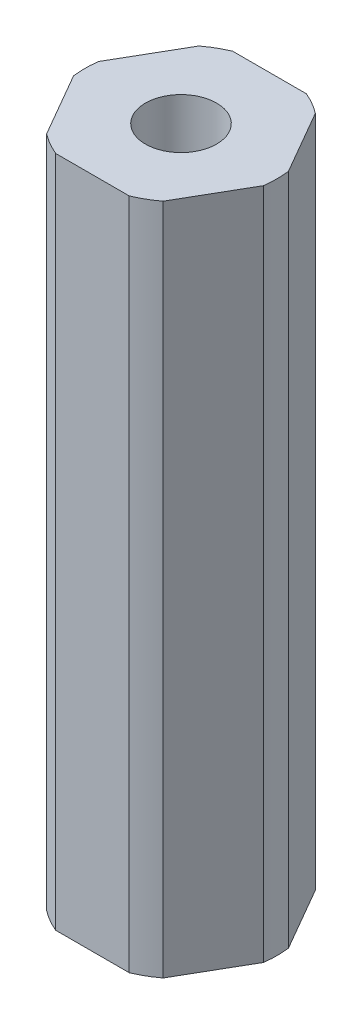
ISO-10303-21;
HEADER;
FILE_DESCRIPTION(('STEP AP214'),'2;1');
FILE_NAME('part.step','',(''),(''),'','','');
FILE_SCHEMA(('AUTOMOTIVE_DESIGN { 1 0 10303 214 1 1 1 1 }'));
ENDSEC;
DATA;
#1=APPLICATION_CONTEXT('core data for automotive mechanical design processes');
#2=APPLICATION_PROTOCOL_DEFINITION('international standard','automotive_design',2000,#1);
#3=PRODUCT_CONTEXT('',#1,'mechanical');
#4=PRODUCT('Part','Part','',(#3));
#5=PRODUCT_RELATED_PRODUCT_CATEGORY('part','',(#4));
#6=PRODUCT_DEFINITION_FORMATION('','',#4);
#7=PRODUCT_DEFINITION_CONTEXT('part definition',#1,'design');
#8=PRODUCT_DEFINITION('design','',#6,#7);
#9=PRODUCT_DEFINITION_SHAPE('','',#8);
#10=(LENGTH_UNIT() NAMED_UNIT(*) SI_UNIT(.MILLI.,.METRE.));
#11=(NAMED_UNIT(*) PLANE_ANGLE_UNIT() SI_UNIT($,.RADIAN.));
#12=(NAMED_UNIT(*) SI_UNIT($,.STERADIAN.) SOLID_ANGLE_UNIT());
#13=UNCERTAINTY_MEASURE_WITH_UNIT(LENGTH_MEASURE(1.E-05),#10,'distance_accuracy_value','');
#14=(GEOMETRIC_REPRESENTATION_CONTEXT(3) GLOBAL_UNCERTAINTY_ASSIGNED_CONTEXT((#13)) GLOBAL_UNIT_ASSIGNED_CONTEXT((#10,
#11,#12)) REPRESENTATION_CONTEXT('',''));
#15=CARTESIAN_POINT('',(0.,0.,0.));
#16=DIRECTION('',(0.,0.,1.));
#17=DIRECTION('',(1.,0.,0.));
#18=AXIS2_PLACEMENT_3D('',#15,#16,#17);
#19=CARTESIAN_POINT('',(0.,24.13,6.35));
#20=DIRECTION('',(0.,0.,-1.));
#21=DIRECTION('',(-1.,0.,0.));
#22=AXIS2_PLACEMENT_3D('',#19,#20,#21);
#23=PLANE('',#22);
#24=DIRECTION('',(1.,0.,0.));
#25=VECTOR('',#24,1.);
#26=CARTESIAN_POINT('',(0.,-24.13,6.35));
#27=LINE('',#26,#25);
#28=CARTESIAN_POINT('',(-2.63701547367474,-24.13,6.35));
#29=VERTEX_POINT('',#28);
#30=CARTESIAN_POINT('',(2.63701547367474,-24.13,6.35));
#31=VERTEX_POINT('',#30);
#32=EDGE_CURVE('E163',#29,#31,#27,.T.);
#33=ORIENTED_EDGE('',*,*,#32,.T.);
#34=DIRECTION('',(0.,-1.,0.));
#35=VECTOR('',#34,1.);
#36=CARTESIAN_POINT('',(2.63701547367474,24.13,6.35));
#37=LINE('',#36,#35);
#38=CARTESIAN_POINT('',(2.63701547367474,24.13,6.35));
#39=VERTEX_POINT('',#38);
#40=EDGE_CURVE('E11',#39,#31,#37,.T.);
#41=ORIENTED_EDGE('',*,*,#40,.F.);
#42=DIRECTION('',(1.,0.,0.));
#43=VECTOR('',#42,1.);
#44=CARTESIAN_POINT('',(0.,24.13,6.35));
#45=LINE('',#44,#43);
#46=CARTESIAN_POINT('',(-2.63701547367474,24.13,6.35));
#47=VERTEX_POINT('',#46);
#48=EDGE_CURVE('E222',#47,#39,#45,.T.);
#49=ORIENTED_EDGE('',*,*,#48,.F.);
#50=DIRECTION('',(0.,-1.,0.));
#51=VECTOR('',#50,1.);
#52=CARTESIAN_POINT('',(-2.63701547367474,24.13,6.35));
#53=LINE('',#52,#51);
#54=EDGE_CURVE('E156',#47,#29,#53,.T.);
#55=ORIENTED_EDGE('',*,*,#54,.T.);
#56=EDGE_LOOP('',(#33,#41,#49,#55));
#57=FACE_BOUND('',#56,.T.);
#58=ADVANCED_FACE('F38',(#57),#23,.F.);
#59=CARTESIAN_POINT('',(0.,24.13,0.));
#60=DIRECTION('',(0.,-1.,0.));
#61=DIRECTION('',(0.,0.,-1.));
#62=AXIS2_PLACEMENT_3D('',#59,#60,#61);
#63=CYLINDRICAL_SURFACE('',#62,6.87578);
#64=CARTESIAN_POINT('',(0.,-24.13,0.));
#65=DIRECTION('',(0.,1.,0.));
#66=DIRECTION('',(0.,0.,1.));
#67=AXIS2_PLACEMENT_3D('',#64,#65,#66);
#68=CIRCLE('',#67,6.87578);
#69=CARTESIAN_POINT('',(4.18075357719382,-24.13,5.45872239037497));
#70=VERTEX_POINT('',#69);
#71=EDGE_CURVE('E166',#31,#70,#68,.T.);
#72=ORIENTED_EDGE('',*,*,#71,.T.);
#73=DIRECTION('',(0.,-1.,0.));
#74=VECTOR('',#73,1.);
#75=CARTESIAN_POINT('',(4.18075357719382,24.13,5.45872239037497));
#76=LINE('',#75,#74);
#77=CARTESIAN_POINT('',(4.18075357719382,24.13,5.45872239037497));
#78=VERTEX_POINT('',#77);
#79=EDGE_CURVE('E47',#78,#70,#76,.T.);
#80=ORIENTED_EDGE('',*,*,#79,.F.);
#81=CARTESIAN_POINT('',(0.,24.13,0.));
#82=DIRECTION('',(0.,1.,0.));
#83=DIRECTION('',(0.,0.,1.));
#84=AXIS2_PLACEMENT_3D('',#81,#82,#83);
#85=CIRCLE('',#84,6.87578);
#86=EDGE_CURVE('E110',#39,#78,#85,.T.);
#87=ORIENTED_EDGE('',*,*,#86,.F.);
#88=ORIENTED_EDGE('',*,*,#40,.T.);
#89=EDGE_LOOP('',(#72,#80,#87,#88));
#90=FACE_BOUND('',#89,.T.);
#91=ADVANCED_FACE('F257',(#90),#63,.T.);
#92=CARTESIAN_POINT('',(5.49926131403119,24.13,3.175));
#93=DIRECTION('',(-0.866025403784439,0.,-0.5));
#94=DIRECTION('',(-0.5,0.,0.866025403784439));
#95=AXIS2_PLACEMENT_3D('',#92,#93,#94);
#96=PLANE('',#95);
#97=DIRECTION('',(0.5,0.,-0.866025403784439));
#98=VECTOR('',#97,1.);
#99=CARTESIAN_POINT('',(5.49926131403119,-24.13,3.175));
#100=LINE('',#99,#98);
#101=CARTESIAN_POINT('',(6.81776905086855,-24.13,0.891277609625022));
#102=VERTEX_POINT('',#101);
#103=EDGE_CURVE('E168',#70,#102,#100,.T.);
#104=ORIENTED_EDGE('',*,*,#103,.T.);
#105=DIRECTION('',(0.,-1.,0.));
#106=VECTOR('',#105,1.);
#107=CARTESIAN_POINT('',(6.81776905086855,24.13,0.891277609625022));
#108=LINE('',#107,#106);
#109=CARTESIAN_POINT('',(6.81776905086855,24.13,0.891277609625022));
#110=VERTEX_POINT('',#109);
#111=EDGE_CURVE('E198',#110,#102,#108,.T.);
#112=ORIENTED_EDGE('',*,*,#111,.F.);
#113=DIRECTION('',(0.5,0.,-0.866025403784439));
#114=VECTOR('',#113,1.);
#115=CARTESIAN_POINT('',(5.49926131403119,24.13,3.175));
#116=LINE('',#115,#114);
#117=EDGE_CURVE('E206',#78,#110,#116,.T.);
#118=ORIENTED_EDGE('',*,*,#117,.F.);
#119=ORIENTED_EDGE('',*,*,#79,.T.);
#120=EDGE_LOOP('',(#104,#112,#118,#119));
#121=FACE_BOUND('',#120,.T.);
#122=ADVANCED_FACE('F204',(#121),#96,.F.);
#123=CARTESIAN_POINT('',(6.81776905086856,-24.13,-0.891277609625022));
#124=VERTEX_POINT('',#123);
#125=EDGE_CURVE('E169',#102,#124,#68,.T.);
#126=ORIENTED_EDGE('',*,*,#125,.T.);
#127=DIRECTION('',(0.,-1.,0.));
#128=VECTOR('',#127,1.);
#129=CARTESIAN_POINT('',(6.81776905086856,24.13,-0.891277609625022));
#130=LINE('',#129,#128);
#131=CARTESIAN_POINT('',(6.81776905086856,24.13,-0.891277609625022));
#132=VERTEX_POINT('',#131);
#133=EDGE_CURVE('E195',#132,#124,#130,.T.);
#134=ORIENTED_EDGE('',*,*,#133,.F.);
#135=EDGE_CURVE('E228',#110,#132,#85,.T.);
#136=ORIENTED_EDGE('',*,*,#135,.F.);
#137=ORIENTED_EDGE('',*,*,#111,.T.);
#138=EDGE_LOOP('',(#126,#134,#136,#137));
#139=FACE_BOUND('',#138,.T.);
#140=ADVANCED_FACE('F239',(#139),#63,.T.);
#141=CARTESIAN_POINT('',(5.49926131403118,24.13,-3.175));
#142=DIRECTION('',(-0.866025403784438,0.,0.5));
#143=DIRECTION('',(0.5,0.,0.866025403784439));
#144=AXIS2_PLACEMENT_3D('',#141,#142,#143);
#145=PLANE('',#144);
#146=DIRECTION('',(-0.5,0.,-0.866025403784439));
#147=VECTOR('',#146,1.);
#148=CARTESIAN_POINT('',(5.49926131403118,-24.13,-3.175));
#149=LINE('',#148,#147);
#150=CARTESIAN_POINT('',(4.18075357719381,-24.13,-5.45872239037498));
#151=VERTEX_POINT('',#150);
#152=EDGE_CURVE('E171',#124,#151,#149,.T.);
#153=ORIENTED_EDGE('',*,*,#152,.T.);
#154=DIRECTION('',(0.,-1.,0.));
#155=VECTOR('',#154,1.);
#156=CARTESIAN_POINT('',(4.18075357719381,24.13,-5.45872239037498));
#157=LINE('',#156,#155);
#158=CARTESIAN_POINT('',(4.18075357719381,24.13,-5.45872239037498));
#159=VERTEX_POINT('',#158);
#160=EDGE_CURVE('E192',#159,#151,#157,.T.);
#161=ORIENTED_EDGE('',*,*,#160,.F.);
#162=DIRECTION('',(-0.5,0.,-0.866025403784439));
#163=VECTOR('',#162,1.);
#164=CARTESIAN_POINT('',(5.49926131403118,24.13,-3.175));
#165=LINE('',#164,#163);
#166=EDGE_CURVE('E230',#132,#159,#165,.T.);
#167=ORIENTED_EDGE('',*,*,#166,.F.);
#168=ORIENTED_EDGE('',*,*,#133,.T.);
#169=EDGE_LOOP('',(#153,#161,#167,#168));
#170=FACE_BOUND('',#169,.T.);
#171=ADVANCED_FACE('F241',(#170),#145,.F.);
#172=CARTESIAN_POINT('',(2.63701547367473,-24.13,-6.35));
#173=VERTEX_POINT('',#172);
#174=EDGE_CURVE('E173',#151,#173,#68,.T.);
#175=ORIENTED_EDGE('',*,*,#174,.T.);
#176=DIRECTION('',(0.,-1.,0.));
#177=VECTOR('',#176,1.);
#178=CARTESIAN_POINT('',(2.63701547367473,24.13,-6.35));
#179=LINE('',#178,#177);
#180=CARTESIAN_POINT('',(2.63701547367473,24.13,-6.35));
#181=VERTEX_POINT('',#180);
#182=EDGE_CURVE('E189',#181,#173,#179,.T.);
#183=ORIENTED_EDGE('',*,*,#182,.F.);
#184=EDGE_CURVE('E231',#159,#181,#85,.T.);
#185=ORIENTED_EDGE('',*,*,#184,.F.);
#186=ORIENTED_EDGE('',*,*,#160,.T.);
#187=EDGE_LOOP('',(#175,#183,#185,#186));
#188=FACE_BOUND('',#187,.T.);
#189=ADVANCED_FACE('F242',(#188),#63,.T.);
#190=CARTESIAN_POINT('',(0.,24.13,-6.35));
#191=DIRECTION('',(0.,0.,1.));
#192=DIRECTION('',(1.,0.,0.));
#193=AXIS2_PLACEMENT_3D('',#190,#191,#192);
#194=PLANE('',#193);
#195=DIRECTION('',(-1.,0.,0.));
#196=VECTOR('',#195,1.);
#197=CARTESIAN_POINT('',(0.,-24.13,-6.35));
#198=LINE('',#197,#196);
#199=CARTESIAN_POINT('',(-2.63701547367473,-24.13,-6.35));
#200=VERTEX_POINT('',#199);
#201=EDGE_CURVE('E174',#173,#200,#198,.T.);
#202=ORIENTED_EDGE('',*,*,#201,.T.);
#203=DIRECTION('',(0.,-1.,0.));
#204=VECTOR('',#203,1.);
#205=CARTESIAN_POINT('',(-2.63701547367473,24.13,-6.35));
#206=LINE('',#205,#204);
#207=CARTESIAN_POINT('',(-2.63701547367473,24.13,-6.35));
#208=VERTEX_POINT('',#207);
#209=EDGE_CURVE('E186',#208,#200,#206,.T.);
#210=ORIENTED_EDGE('',*,*,#209,.F.);
#211=DIRECTION('',(-1.,0.,0.));
#212=VECTOR('',#211,1.);
#213=CARTESIAN_POINT('',(0.,24.13,-6.35));
#214=LINE('',#213,#212);
#215=EDGE_CURVE('E232',#181,#208,#214,.T.);
#216=ORIENTED_EDGE('',*,*,#215,.F.);
#217=ORIENTED_EDGE('',*,*,#182,.T.);
#218=EDGE_LOOP('',(#202,#210,#216,#217));
#219=FACE_BOUND('',#218,.T.);
#220=ADVANCED_FACE('F245',(#219),#194,.F.);
#221=CARTESIAN_POINT('',(-4.18075357719382,-24.13,-5.45872239037497));
#222=VERTEX_POINT('',#221);
#223=EDGE_CURVE('E176',#200,#222,#68,.T.);
#224=ORIENTED_EDGE('',*,*,#223,.T.);
#225=DIRECTION('',(0.,-1.,0.));
#226=VECTOR('',#225,1.);
#227=CARTESIAN_POINT('',(-4.18075357719382,24.13,-5.45872239037497));
#228=LINE('',#227,#226);
#229=CARTESIAN_POINT('',(-4.18075357719382,24.13,-5.45872239037497));
#230=VERTEX_POINT('',#229);
#231=EDGE_CURVE('E183',#230,#222,#228,.T.);
#232=ORIENTED_EDGE('',*,*,#231,.F.);
#233=EDGE_CURVE('E146',#208,#230,#85,.T.);
#234=ORIENTED_EDGE('',*,*,#233,.F.);
#235=ORIENTED_EDGE('',*,*,#209,.T.);
#236=EDGE_LOOP('',(#224,#232,#234,#235));
#237=FACE_BOUND('',#236,.T.);
#238=ADVANCED_FACE('F247',(#237),#63,.T.);
#239=CARTESIAN_POINT('',(-5.49926131403119,24.13,-3.175));
#240=DIRECTION('',(0.866025403784438,0.,0.5));
#241=DIRECTION('',(0.5,0.,-0.866025403784439));
#242=AXIS2_PLACEMENT_3D('',#239,#240,#241);
#243=PLANE('',#242);
#244=DIRECTION('',(-0.5,0.,0.866025403784439));
#245=VECTOR('',#244,1.);
#246=CARTESIAN_POINT('',(-5.49926131403119,-24.13,-3.175));
#247=LINE('',#246,#245);
#248=CARTESIAN_POINT('',(-6.81776905086855,-24.13,-0.891277609625031));
#249=VERTEX_POINT('',#248);
#250=EDGE_CURVE('E177',#222,#249,#247,.T.);
#251=ORIENTED_EDGE('',*,*,#250,.T.);
#252=DIRECTION('',(0.,-1.,0.));
#253=VECTOR('',#252,1.);
#254=CARTESIAN_POINT('',(-6.81776905086855,24.13,-0.891277609625031));
#255=LINE('',#254,#253);
#256=CARTESIAN_POINT('',(-6.81776905086855,24.13,-0.891277609625031));
#257=VERTEX_POINT('',#256);
#258=EDGE_CURVE('E151',#257,#249,#255,.T.);
#259=ORIENTED_EDGE('',*,*,#258,.F.);
#260=DIRECTION('',(-0.5,0.,0.866025403784439));
#261=VECTOR('',#260,1.);
#262=CARTESIAN_POINT('',(-5.49926131403119,24.13,-3.175));
#263=LINE('',#262,#261);
#264=EDGE_CURVE('E141',#230,#257,#263,.T.);
#265=ORIENTED_EDGE('',*,*,#264,.F.);
#266=ORIENTED_EDGE('',*,*,#231,.T.);
#267=EDGE_LOOP('',(#251,#259,#265,#266));
#268=FACE_BOUND('',#267,.T.);
#269=ADVANCED_FACE('F250',(#268),#243,.F.);
#270=CARTESIAN_POINT('',(-6.81776905086855,-24.13,0.891277609625025));
#271=VERTEX_POINT('',#270);
#272=EDGE_CURVE('E150',#249,#271,#68,.T.);
#273=ORIENTED_EDGE('',*,*,#272,.T.);
#274=DIRECTION('',(0.,-1.,0.));
#275=VECTOR('',#274,1.);
#276=CARTESIAN_POINT('',(-6.81776905086855,24.13,0.891277609625025));
#277=LINE('',#276,#275);
#278=CARTESIAN_POINT('',(-6.81776905086855,24.13,0.891277609625025));
#279=VERTEX_POINT('',#278);
#280=EDGE_CURVE('E147',#279,#271,#277,.T.);
#281=ORIENTED_EDGE('',*,*,#280,.F.);
#282=EDGE_CURVE('E135',#257,#279,#85,.T.);
#283=ORIENTED_EDGE('',*,*,#282,.F.);
#284=ORIENTED_EDGE('',*,*,#258,.T.);
#285=EDGE_LOOP('',(#273,#281,#283,#284));
#286=FACE_BOUND('',#285,.T.);
#287=ADVANCED_FACE('F148',(#286),#63,.T.);
#288=CARTESIAN_POINT('',(-5.49926131403118,24.13,3.175));
#289=DIRECTION('',(0.866025403784438,0.,-0.5));
#290=DIRECTION('',(-0.5,0.,-0.866025403784439));
#291=AXIS2_PLACEMENT_3D('',#288,#289,#290);
#292=PLANE('',#291);
#293=DIRECTION('',(0.5,0.,0.866025403784438));
#294=VECTOR('',#293,1.);
#295=CARTESIAN_POINT('',(-5.49926131403118,-24.13,3.175));
#296=LINE('',#295,#294);
#297=CARTESIAN_POINT('',(-4.18075357719381,-24.13,5.45872239037498));
#298=VERTEX_POINT('',#297);
#299=EDGE_CURVE('E96',#271,#298,#296,.T.);
#300=ORIENTED_EDGE('',*,*,#299,.T.);
#301=DIRECTION('',(0.,-1.,0.));
#302=VECTOR('',#301,1.);
#303=CARTESIAN_POINT('',(-4.18075357719381,24.13,5.45872239037498));
#304=LINE('',#303,#302);
#305=CARTESIAN_POINT('',(-4.18075357719381,24.13,5.45872239037498));
#306=VERTEX_POINT('',#305);
#307=EDGE_CURVE('E152',#306,#298,#304,.T.);
#308=ORIENTED_EDGE('',*,*,#307,.F.);
#309=DIRECTION('',(0.5,0.,0.866025403784438));
#310=VECTOR('',#309,1.);
#311=CARTESIAN_POINT('',(-5.49926131403118,24.13,3.175));
#312=LINE('',#311,#310);
#313=EDGE_CURVE('E139',#279,#306,#312,.T.);
#314=ORIENTED_EDGE('',*,*,#313,.F.);
#315=ORIENTED_EDGE('',*,*,#280,.T.);
#316=EDGE_LOOP('',(#300,#308,#314,#315));
#317=FACE_BOUND('',#316,.T.);
#318=ADVANCED_FACE('F154',(#317),#292,.F.);
#319=CARTESIAN_POINT('',(0.,24.13,0.));
#320=DIRECTION('',(0.,-1.,0.));
#321=DIRECTION('',(0.,0.,-1.));
#322=AXIS2_PLACEMENT_3D('',#319,#320,#321);
#323=CYLINDRICAL_SURFACE('',#322,2.5527);
#324=CARTESIAN_POINT('',(0.,24.13,0.));
#325=DIRECTION('',(0.,1.,0.));
#326=DIRECTION('',(0.,0.,1.));
#327=AXIS2_PLACEMENT_3D('',#324,#325,#326);
#328=CIRCLE('',#327,2.5527);
#329=CARTESIAN_POINT('',(0.,24.13,-2.5527));
#330=VERTEX_POINT('',#329);
#331=EDGE_CURVE('E220',#330,#330,#328,.T.);
#332=CARTESIAN_POINT('',(0.,-24.13,0.));
#333=DIRECTION('',(0.,1.,0.));
#334=DIRECTION('',(0.,0.,1.));
#335=AXIS2_PLACEMENT_3D('',#332,#333,#334);
#336=CIRCLE('',#335,2.5527);
#337=CARTESIAN_POINT('',(0.,-24.13,-2.5527));
#338=VERTEX_POINT('',#337);
#339=EDGE_CURVE('E160',#338,#338,#336,.T.);
#340=CARTESIAN_POINT('',(0.,24.13,-2.5527));
#341=CARTESIAN_POINT('',(0.,23.6272916666667,-2.5527));
#342=CARTESIAN_POINT('',(0.,23.1245833333333,-2.5527));
#343=CARTESIAN_POINT('',(0.,22.1191666666667,-2.5527));
#344=CARTESIAN_POINT('',(0.,21.6164583333333,-2.5527));
#345=CARTESIAN_POINT('',(0.,20.6110416666667,-2.5527));
#346=CARTESIAN_POINT('',(0.,20.1083333333333,-2.5527));
#347=CARTESIAN_POINT('',(0.,19.1029166666667,-2.5527));
#348=CARTESIAN_POINT('',(0.,18.6002083333333,-2.5527));
#349=CARTESIAN_POINT('',(0.,17.5947916666667,-2.5527));
#350=CARTESIAN_POINT('',(0.,17.0920833333333,-2.5527));
#351=CARTESIAN_POINT('',(0.,16.0866666666667,-2.5527));
#352=CARTESIAN_POINT('',(0.,15.5839583333333,-2.5527));
#353=CARTESIAN_POINT('',(0.,14.5785416666667,-2.5527));
#354=CARTESIAN_POINT('',(0.,14.0758333333333,-2.5527));
#355=CARTESIAN_POINT('',(0.,13.0704166666667,-2.5527));
#356=CARTESIAN_POINT('',(0.,12.5677083333333,-2.5527));
#357=CARTESIAN_POINT('',(0.,11.5622916666667,-2.5527));
#358=CARTESIAN_POINT('',(0.,11.0595833333333,-2.5527));
#359=CARTESIAN_POINT('',(0.,10.0541666666667,-2.5527));
#360=CARTESIAN_POINT('',(0.,9.55145833333333,-2.5527));
#361=CARTESIAN_POINT('',(0.,8.54604166666666,-2.5527));
#362=CARTESIAN_POINT('',(0.,8.04333333333333,-2.5527));
#363=CARTESIAN_POINT('',(0.,7.03791666666666,-2.5527));
#364=CARTESIAN_POINT('',(0.,6.53520833333333,-2.5527));
#365=CARTESIAN_POINT('',(0.,5.52979166666666,-2.5527));
#366=CARTESIAN_POINT('',(0.,5.02708333333333,-2.5527));
#367=CARTESIAN_POINT('',(0.,4.02166666666666,-2.5527));
#368=CARTESIAN_POINT('',(0.,3.51895833333333,-2.5527));
#369=CARTESIAN_POINT('',(0.,2.51354166666666,-2.5527));
#370=CARTESIAN_POINT('',(0.,2.01083333333333,-2.5527));
#371=CARTESIAN_POINT('',(0.,1.00541666666666,-2.5527));
#372=CARTESIAN_POINT('',(0.,0.502708333333326,-2.5527));
#373=CARTESIAN_POINT('',(0.,-0.50270833333334,-2.5527));
#374=CARTESIAN_POINT('',(0.,-1.00541666666667,-2.5527));
#375=CARTESIAN_POINT('',(0.,-2.01083333333334,-2.5527));
#376=CARTESIAN_POINT('',(0.,-2.51354166666667,-2.5527));
#377=CARTESIAN_POINT('',(0.,-3.51895833333334,-2.5527));
#378=CARTESIAN_POINT('',(0.,-4.02166666666667,-2.5527));
#379=CARTESIAN_POINT('',(0.,-5.02708333333334,-2.5527));
#380=CARTESIAN_POINT('',(0.,-5.52979166666668,-2.5527));
#381=CARTESIAN_POINT('',(0.,-6.53520833333334,-2.5527));
#382=CARTESIAN_POINT('',(0.,-7.03791666666667,-2.5527));
#383=CARTESIAN_POINT('',(0.,-8.04333333333333,-2.5527));
#384=CARTESIAN_POINT('',(0.,-8.54604166666667,-2.5527));
#385=CARTESIAN_POINT('',(0.,-9.55145833333333,-2.5527));
#386=CARTESIAN_POINT('',(0.,-10.0541666666667,-2.5527));
#387=CARTESIAN_POINT('',(0.,-11.0595833333333,-2.5527));
#388=CARTESIAN_POINT('',(0.,-11.5622916666667,-2.5527));
#389=CARTESIAN_POINT('',(0.,-12.5677083333333,-2.5527));
#390=CARTESIAN_POINT('',(0.,-13.0704166666667,-2.5527));
#391=CARTESIAN_POINT('',(0.,-14.0758333333333,-2.5527));
#392=CARTESIAN_POINT('',(0.,-14.5785416666667,-2.5527));
#393=CARTESIAN_POINT('',(0.,-15.5839583333333,-2.5527));
#394=CARTESIAN_POINT('',(0.,-16.0866666666667,-2.5527));
#395=CARTESIAN_POINT('',(0.,-17.0920833333333,-2.5527));
#396=CARTESIAN_POINT('',(0.,-17.5947916666667,-2.5527));
#397=CARTESIAN_POINT('',(0.,-18.6002083333333,-2.5527));
#398=CARTESIAN_POINT('',(0.,-19.1029166666667,-2.5527));
#399=CARTESIAN_POINT('',(0.,-20.1083333333333,-2.5527));
#400=CARTESIAN_POINT('',(0.,-20.6110416666667,-2.5527));
#401=CARTESIAN_POINT('',(0.,-21.6164583333333,-2.5527));
#402=CARTESIAN_POINT('',(0.,-22.1191666666667,-2.5527));
#403=CARTESIAN_POINT('',(0.,-23.1245833333333,-2.5527));
#404=CARTESIAN_POINT('',(0.,-23.6272916666667,-2.5527));
#405=CARTESIAN_POINT('',(0.,-24.13,-2.5527));
#406=B_SPLINE_CURVE_WITH_KNOTS('',3,(#340,#341,#342,#343,#344,#345,#346,#347,#348,#349,#350,
#351,#352,#353,#354,#355,#356,#357,#358,#359,#360,#361,#362,#363,#364,#365,#366,#367,#368,#369,
#370,#371,#372,#373,#374,#375,#376,#377,#378,#379,#380,#381,#382,#383,#384,#385,#386,#387,#388,
#389,#390,#391,#392,#393,#394,#395,#396,#397,#398,#399,#400,#401,#402,#403,#404,#405),
.UNSPECIFIED.,.F.,.F.,(4,2,2,2,2,2,2,2,2,2,2,2,2,2,2,2,2,2,2,2,2,2,2,2,2,2,2,2,2,2,2,2,4),(0.,
1.508125,3.01625,4.524375,6.0325,7.540625,9.04875,10.556875,12.065,13.573125,15.08125,16.589375,
18.0975,19.605625,21.11375,22.621875,24.13,25.638125,27.14625,28.654375,30.1625,31.670625,
33.17875,34.686875,36.195,37.703125,39.21125,40.719375,42.2275,43.735625,45.24375,46.751875,
48.26),.UNSPECIFIED.);
#407=EDGE_CURVE('BSEAM40',#330,#338,#406,.T.);
#408=ORIENTED_EDGE('',*,*,#331,.T.);
#409=ORIENTED_EDGE('',*,*,#339,.F.);
#410=ORIENTED_EDGE('',*,*,#407,.T.);
#411=ORIENTED_EDGE('',*,*,#407,.F.);
#412=EDGE_LOOP('',(#408,#410,#409,#411));
#413=FACE_BOUND('',#412,.T.);
#414=ADVANCED_FACE('F40',(#413),#323,.F.);
#415=EDGE_CURVE('E102',#298,#29,#68,.T.);
#416=ORIENTED_EDGE('',*,*,#415,.T.);
#417=ORIENTED_EDGE('',*,*,#54,.F.);
#418=EDGE_CURVE('E55',#306,#47,#85,.T.);
#419=ORIENTED_EDGE('',*,*,#418,.F.);
#420=ORIENTED_EDGE('',*,*,#307,.T.);
#421=EDGE_LOOP('',(#416,#417,#419,#420));
#422=FACE_BOUND('',#421,.T.);
#423=ADVANCED_FACE('F254',(#422),#63,.T.);
#424=CARTESIAN_POINT('',(0.,24.13,0.));
#425=DIRECTION('',(0.,1.,0.));
#426=DIRECTION('',(0.,0.,1.));
#427=AXIS2_PLACEMENT_3D('',#424,#425,#426);
#428=PLANE('',#427);
#429=ORIENTED_EDGE('',*,*,#331,.F.);
#430=EDGE_LOOP('',(#429));
#431=FACE_BOUND('',#430,.T.);
#432=ORIENTED_EDGE('',*,*,#48,.T.);
#433=ORIENTED_EDGE('',*,*,#86,.T.);
#434=ORIENTED_EDGE('',*,*,#117,.T.);
#435=ORIENTED_EDGE('',*,*,#135,.T.);
#436=ORIENTED_EDGE('',*,*,#166,.T.);
#437=ORIENTED_EDGE('',*,*,#184,.T.);
#438=ORIENTED_EDGE('',*,*,#215,.T.);
#439=ORIENTED_EDGE('',*,*,#233,.T.);
#440=ORIENTED_EDGE('',*,*,#264,.T.);
#441=ORIENTED_EDGE('',*,*,#282,.T.);
#442=ORIENTED_EDGE('',*,*,#313,.T.);
#443=ORIENTED_EDGE('',*,*,#418,.T.);
#444=EDGE_LOOP('',(#432,#433,#434,#435,#436,#437,#438,#439,#440,#441,#442,#443));
#445=FACE_BOUND('',#444,.T.);
#446=ADVANCED_FACE('F137',(#431,#445),#428,.T.);
#447=CARTESIAN_POINT('',(0.,-24.13,0.));
#448=DIRECTION('',(0.,1.,0.));
#449=DIRECTION('',(0.,0.,1.));
#450=AXIS2_PLACEMENT_3D('',#447,#448,#449);
#451=PLANE('',#450);
#452=ORIENTED_EDGE('',*,*,#339,.T.);
#453=EDGE_LOOP('',(#452));
#454=FACE_BOUND('',#453,.T.);
#455=ORIENTED_EDGE('',*,*,#32,.F.);
#456=ORIENTED_EDGE('',*,*,#415,.F.);
#457=ORIENTED_EDGE('',*,*,#299,.F.);
#458=ORIENTED_EDGE('',*,*,#272,.F.);
#459=ORIENTED_EDGE('',*,*,#250,.F.);
#460=ORIENTED_EDGE('',*,*,#223,.F.);
#461=ORIENTED_EDGE('',*,*,#201,.F.);
#462=ORIENTED_EDGE('',*,*,#174,.F.);
#463=ORIENTED_EDGE('',*,*,#152,.F.);
#464=ORIENTED_EDGE('',*,*,#125,.F.);
#465=ORIENTED_EDGE('',*,*,#103,.F.);
#466=ORIENTED_EDGE('',*,*,#71,.F.);
#467=EDGE_LOOP('',(#455,#456,#457,#458,#459,#460,#461,#462,#463,#464,#465,#466));
#468=FACE_BOUND('',#467,.T.);
#469=ADVANCED_FACE('F210',(#454,#468),#451,.F.);
#470=CLOSED_SHELL('',(#58,#91,#122,#140,#171,#189,#220,#238,#269,#287,#318,#414,#423,#446,#469));
#471=MANIFOLD_SOLID_BREP('B2',#470);
#472=ADVANCED_BREP_SHAPE_REPRESENTATION('',(#18,#471),#14);
#473=SHAPE_DEFINITION_REPRESENTATION(#9,#472);
ENDSEC;
END-ISO-10303-21;
